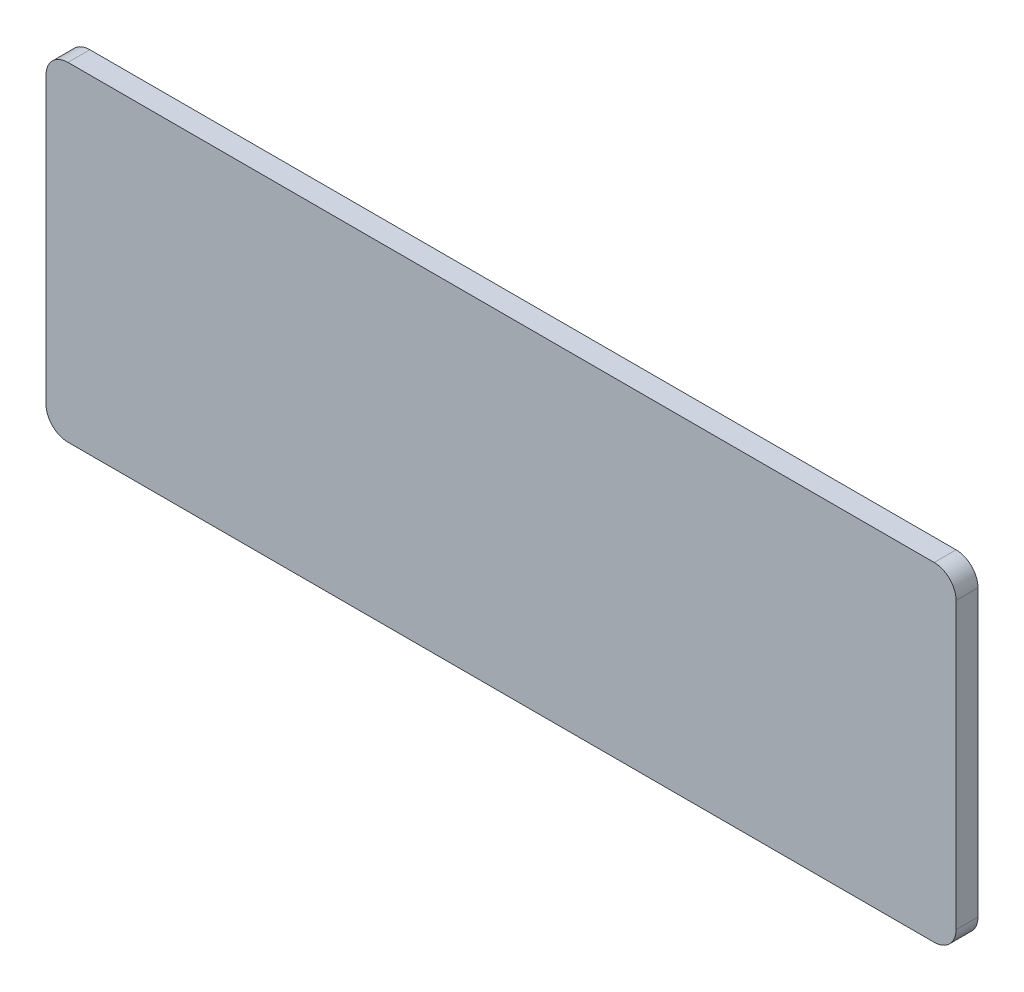
ISO-10303-21;
HEADER;
FILE_DESCRIPTION(('STEP AP214'),'2;1');
FILE_NAME('part.step','',(''),(''),'','','');
FILE_SCHEMA(('AUTOMOTIVE_DESIGN { 1 0 10303 214 1 1 1 1 }'));
ENDSEC;
DATA;
#1=APPLICATION_CONTEXT('core data for automotive mechanical design processes');
#2=APPLICATION_PROTOCOL_DEFINITION('international standard','automotive_design',2000,#1);
#3=PRODUCT_CONTEXT('',#1,'mechanical');
#4=PRODUCT('Part','Part','',(#3));
#5=PRODUCT_RELATED_PRODUCT_CATEGORY('part','',(#4));
#6=PRODUCT_DEFINITION_FORMATION('','',#4);
#7=PRODUCT_DEFINITION_CONTEXT('part definition',#1,'design');
#8=PRODUCT_DEFINITION('design','',#6,#7);
#9=PRODUCT_DEFINITION_SHAPE('','',#8);
#10=(LENGTH_UNIT() NAMED_UNIT(*) SI_UNIT(.MILLI.,.METRE.));
#11=(NAMED_UNIT(*) PLANE_ANGLE_UNIT() SI_UNIT($,.RADIAN.));
#12=(NAMED_UNIT(*) SI_UNIT($,.STERADIAN.) SOLID_ANGLE_UNIT());
#13=UNCERTAINTY_MEASURE_WITH_UNIT(LENGTH_MEASURE(1.E-05),#10,'distance_accuracy_value','');
#14=(GEOMETRIC_REPRESENTATION_CONTEXT(3) GLOBAL_UNCERTAINTY_ASSIGNED_CONTEXT((#13)) GLOBAL_UNIT_ASSIGNED_CONTEXT((#10,
#11,#12)) REPRESENTATION_CONTEXT('',''));
#15=CARTESIAN_POINT('',(0.,0.,0.));
#16=DIRECTION('',(0.,0.,1.));
#17=DIRECTION('',(1.,0.,0.));
#18=AXIS2_PLACEMENT_3D('',#15,#16,#17);
#19=CARTESIAN_POINT('',(205.,50.,10.));
#20=DIRECTION('',(0.,0.,-1.));
#21=DIRECTION('',(-1.,0.,0.));
#22=AXIS2_PLACEMENT_3D('',#19,#20,#21);
#23=CYLINDRICAL_SURFACE('',#22,10.);
#24=CARTESIAN_POINT('',(205.,50.,0.));
#25=DIRECTION('',(0.,0.,1.));
#26=DIRECTION('',(-1.,0.,0.));
#27=AXIS2_PLACEMENT_3D('',#24,#25,#26);
#28=CIRCLE('',#27,10.);
#29=CARTESIAN_POINT('',(215.,50.,0.));
#30=VERTEX_POINT('',#29);
#31=CARTESIAN_POINT('',(205.,60.,0.));
#32=VERTEX_POINT('',#31);
#33=EDGE_CURVE('E140',#30,#32,#28,.T.);
#34=ORIENTED_EDGE('',*,*,#33,.T.);
#35=DIRECTION('',(0.,0.,-1.));
#36=VECTOR('',#35,1.);
#37=CARTESIAN_POINT('',(205.,60.,10.));
#38=LINE('',#37,#36);
#39=CARTESIAN_POINT('',(205.,60.,10.));
#40=VERTEX_POINT('',#39);
#41=EDGE_CURVE('E11',#40,#32,#38,.T.);
#42=ORIENTED_EDGE('',*,*,#41,.F.);
#43=CARTESIAN_POINT('',(205.,50.,10.));
#44=DIRECTION('',(0.,0.,1.));
#45=DIRECTION('',(-1.,0.,0.));
#46=AXIS2_PLACEMENT_3D('',#43,#44,#45);
#47=CIRCLE('',#46,10.);
#48=CARTESIAN_POINT('',(215.,50.,10.));
#49=VERTEX_POINT('',#48);
#50=EDGE_CURVE('E162',#49,#40,#47,.T.);
#51=ORIENTED_EDGE('',*,*,#50,.F.);
#52=DIRECTION('',(0.,0.,-1.));
#53=VECTOR('',#52,1.);
#54=CARTESIAN_POINT('',(215.,50.,10.));
#55=LINE('',#54,#53);
#56=EDGE_CURVE('E136',#49,#30,#55,.T.);
#57=ORIENTED_EDGE('',*,*,#56,.T.);
#58=EDGE_LOOP('',(#34,#42,#51,#57));
#59=FACE_BOUND('',#58,.T.);
#60=ADVANCED_FACE('F39',(#59),#23,.T.);
#61=CARTESIAN_POINT('',(205.,60.,10.));
#62=DIRECTION('',(0.,-1.,0.));
#63=DIRECTION('',(1.,0.,0.));
#64=AXIS2_PLACEMENT_3D('',#61,#62,#63);
#65=PLANE('',#64);
#66=DIRECTION('',(-1.,0.,0.));
#67=VECTOR('',#66,1.);
#68=CARTESIAN_POINT('',(205.,60.,0.));
#69=LINE('',#68,#67);
#70=CARTESIAN_POINT('',(-190.,60.,0.));
#71=VERTEX_POINT('',#70);
#72=EDGE_CURVE('E144',#32,#71,#69,.T.);
#73=ORIENTED_EDGE('',*,*,#72,.T.);
#74=DIRECTION('',(0.,0.,-1.));
#75=VECTOR('',#74,1.);
#76=CARTESIAN_POINT('',(-190.,60.,10.));
#77=LINE('',#76,#75);
#78=CARTESIAN_POINT('',(-190.,60.,10.));
#79=VERTEX_POINT('',#78);
#80=EDGE_CURVE('E48',#79,#71,#77,.T.);
#81=ORIENTED_EDGE('',*,*,#80,.F.);
#82=DIRECTION('',(-1.,0.,0.));
#83=VECTOR('',#82,1.);
#84=CARTESIAN_POINT('',(205.,60.,10.));
#85=LINE('',#84,#83);
#86=EDGE_CURVE('E99',#40,#79,#85,.T.);
#87=ORIENTED_EDGE('',*,*,#86,.F.);
#88=ORIENTED_EDGE('',*,*,#41,.T.);
#89=EDGE_LOOP('',(#73,#81,#87,#88));
#90=FACE_BOUND('',#89,.T.);
#91=ADVANCED_FACE('F208',(#90),#65,.F.);
#92=CARTESIAN_POINT('',(-190.,50.,10.));
#93=DIRECTION('',(0.,0.,-1.));
#94=DIRECTION('',(-1.,0.,0.));
#95=AXIS2_PLACEMENT_3D('',#92,#93,#94);
#96=CYLINDRICAL_SURFACE('',#95,10.);
#97=CARTESIAN_POINT('',(-190.,50.,0.));
#98=DIRECTION('',(0.,0.,1.));
#99=DIRECTION('',(1.,0.,0.));
#100=AXIS2_PLACEMENT_3D('',#97,#98,#99);
#101=CIRCLE('',#100,10.);
#102=CARTESIAN_POINT('',(-200.,50.,0.));
#103=VERTEX_POINT('',#102);
#104=EDGE_CURVE('E147',#71,#103,#101,.T.);
#105=ORIENTED_EDGE('',*,*,#104,.T.);
#106=DIRECTION('',(0.,0.,-1.));
#107=VECTOR('',#106,1.);
#108=CARTESIAN_POINT('',(-200.,50.,10.));
#109=LINE('',#108,#107);
#110=CARTESIAN_POINT('',(-200.,50.,10.));
#111=VERTEX_POINT('',#110);
#112=EDGE_CURVE('E173',#111,#103,#109,.T.);
#113=ORIENTED_EDGE('',*,*,#112,.F.);
#114=CARTESIAN_POINT('',(-190.,50.,10.));
#115=DIRECTION('',(0.,0.,1.));
#116=DIRECTION('',(1.,0.,0.));
#117=AXIS2_PLACEMENT_3D('',#114,#115,#116);
#118=CIRCLE('',#117,10.);
#119=EDGE_CURVE('E183',#79,#111,#118,.T.);
#120=ORIENTED_EDGE('',*,*,#119,.F.);
#121=ORIENTED_EDGE('',*,*,#80,.T.);
#122=EDGE_LOOP('',(#105,#113,#120,#121));
#123=FACE_BOUND('',#122,.T.);
#124=ADVANCED_FACE('F181',(#123),#96,.T.);
#125=CARTESIAN_POINT('',(-200.,50.,10.));
#126=DIRECTION('',(1.,0.,0.));
#127=DIRECTION('',(0.,1.,0.));
#128=AXIS2_PLACEMENT_3D('',#125,#126,#127);
#129=PLANE('',#128);
#130=DIRECTION('',(0.,-1.,0.));
#131=VECTOR('',#130,1.);
#132=CARTESIAN_POINT('',(-200.,50.,0.));
#133=LINE('',#132,#131);
#134=CARTESIAN_POINT('',(-200.,-79.9999999999999,0.));
#135=VERTEX_POINT('',#134);
#136=EDGE_CURVE('E150',#103,#135,#133,.T.);
#137=ORIENTED_EDGE('',*,*,#136,.T.);
#138=DIRECTION('',(0.,0.,-1.));
#139=VECTOR('',#138,1.);
#140=CARTESIAN_POINT('',(-200.,-79.9999999999999,10.));
#141=LINE('',#140,#139);
#142=CARTESIAN_POINT('',(-200.,-79.9999999999999,10.));
#143=VERTEX_POINT('',#142);
#144=EDGE_CURVE('E169',#143,#135,#141,.T.);
#145=ORIENTED_EDGE('',*,*,#144,.F.);
#146=DIRECTION('',(0.,-1.,0.));
#147=VECTOR('',#146,1.);
#148=CARTESIAN_POINT('',(-200.,50.,10.));
#149=LINE('',#148,#147);
#150=EDGE_CURVE('E196',#111,#143,#149,.T.);
#151=ORIENTED_EDGE('',*,*,#150,.F.);
#152=ORIENTED_EDGE('',*,*,#112,.T.);
#153=EDGE_LOOP('',(#137,#145,#151,#152));
#154=FACE_BOUND('',#153,.T.);
#155=ADVANCED_FACE('F191',(#154),#129,.F.);
#156=CARTESIAN_POINT('',(-190.,-80.,10.));
#157=DIRECTION('',(0.,0.,-1.));
#158=DIRECTION('',(-1.,0.,0.));
#159=AXIS2_PLACEMENT_3D('',#156,#157,#158);
#160=CYLINDRICAL_SURFACE('',#159,9.99999999999998);
#161=CARTESIAN_POINT('',(-190.,-80.,0.));
#162=DIRECTION('',(0.,0.,1.));
#163=DIRECTION('',(-1.,0.,0.));
#164=AXIS2_PLACEMENT_3D('',#161,#162,#163);
#165=CIRCLE('',#164,9.99999999999998);
#166=CARTESIAN_POINT('',(-190.,-90.,0.));
#167=VERTEX_POINT('',#166);
#168=EDGE_CURVE('E153',#135,#167,#165,.T.);
#169=ORIENTED_EDGE('',*,*,#168,.T.);
#170=DIRECTION('',(0.,0.,-1.));
#171=VECTOR('',#170,1.);
#172=CARTESIAN_POINT('',(-190.,-90.,10.));
#173=LINE('',#172,#171);
#174=CARTESIAN_POINT('',(-190.,-90.,10.));
#175=VERTEX_POINT('',#174);
#176=EDGE_CURVE('E129',#175,#167,#173,.T.);
#177=ORIENTED_EDGE('',*,*,#176,.F.);
#178=CARTESIAN_POINT('',(-190.,-80.,10.));
#179=DIRECTION('',(0.,0.,1.));
#180=DIRECTION('',(-1.,0.,0.));
#181=AXIS2_PLACEMENT_3D('',#178,#179,#180);
#182=CIRCLE('',#181,9.99999999999998);
#183=EDGE_CURVE('E118',#143,#175,#182,.T.);
#184=ORIENTED_EDGE('',*,*,#183,.F.);
#185=ORIENTED_EDGE('',*,*,#144,.T.);
#186=EDGE_LOOP('',(#169,#177,#184,#185));
#187=FACE_BOUND('',#186,.T.);
#188=ADVANCED_FACE('F194',(#187),#160,.T.);
#189=CARTESIAN_POINT('',(205.,-90.,10.));
#190=DIRECTION('',(0.,1.,0.));
#191=DIRECTION('',(-1.,0.,0.));
#192=AXIS2_PLACEMENT_3D('',#189,#190,#191);
#193=PLANE('',#192);
#194=DIRECTION('',(1.,0.,0.));
#195=VECTOR('',#194,1.);
#196=CARTESIAN_POINT('',(205.,-90.,0.));
#197=LINE('',#196,#195);
#198=CARTESIAN_POINT('',(205.,-90.,0.));
#199=VERTEX_POINT('',#198);
#200=EDGE_CURVE('E127',#167,#199,#197,.T.);
#201=ORIENTED_EDGE('',*,*,#200,.T.);
#202=DIRECTION('',(0.,0.,-1.));
#203=VECTOR('',#202,1.);
#204=CARTESIAN_POINT('',(205.,-90.,10.));
#205=LINE('',#204,#203);
#206=CARTESIAN_POINT('',(205.,-90.,10.));
#207=VERTEX_POINT('',#206);
#208=EDGE_CURVE('E124',#207,#199,#205,.T.);
#209=ORIENTED_EDGE('',*,*,#208,.F.);
#210=DIRECTION('',(1.,0.,0.));
#211=VECTOR('',#210,1.);
#212=CARTESIAN_POINT('',(205.,-90.,10.));
#213=LINE('',#212,#211);
#214=EDGE_CURVE('E112',#175,#207,#213,.T.);
#215=ORIENTED_EDGE('',*,*,#214,.F.);
#216=ORIENTED_EDGE('',*,*,#176,.T.);
#217=EDGE_LOOP('',(#201,#209,#215,#216));
#218=FACE_BOUND('',#217,.T.);
#219=ADVANCED_FACE('F125',(#218),#193,.F.);
#220=CARTESIAN_POINT('',(205.,-80.,10.));
#221=DIRECTION('',(0.,0.,-1.));
#222=DIRECTION('',(-1.,0.,0.));
#223=AXIS2_PLACEMENT_3D('',#220,#221,#222);
#224=CYLINDRICAL_SURFACE('',#223,9.99999999999999);
#225=CARTESIAN_POINT('',(205.,-80.,0.));
#226=DIRECTION('',(0.,0.,1.));
#227=DIRECTION('',(-1.,0.,0.));
#228=AXIS2_PLACEMENT_3D('',#225,#226,#227);
#229=CIRCLE('',#228,9.99999999999999);
#230=CARTESIAN_POINT('',(215.,-79.9999999999999,0.));
#231=VERTEX_POINT('',#230);
#232=EDGE_CURVE('E85',#199,#231,#229,.T.);
#233=ORIENTED_EDGE('',*,*,#232,.T.);
#234=DIRECTION('',(0.,0.,-1.));
#235=VECTOR('',#234,1.);
#236=CARTESIAN_POINT('',(215.,-79.9999999999999,10.));
#237=LINE('',#236,#235);
#238=CARTESIAN_POINT('',(215.,-79.9999999999999,10.));
#239=VERTEX_POINT('',#238);
#240=EDGE_CURVE('E130',#239,#231,#237,.T.);
#241=ORIENTED_EDGE('',*,*,#240,.F.);
#242=CARTESIAN_POINT('',(205.,-80.,10.));
#243=DIRECTION('',(0.,0.,1.));
#244=DIRECTION('',(-1.,0.,0.));
#245=AXIS2_PLACEMENT_3D('',#242,#243,#244);
#246=CIRCLE('',#245,9.99999999999999);
#247=EDGE_CURVE('E116',#207,#239,#246,.T.);
#248=ORIENTED_EDGE('',*,*,#247,.F.);
#249=ORIENTED_EDGE('',*,*,#208,.T.);
#250=EDGE_LOOP('',(#233,#241,#248,#249));
#251=FACE_BOUND('',#250,.T.);
#252=ADVANCED_FACE('F132',(#251),#224,.T.);
#253=CARTESIAN_POINT('',(215.,50.,10.));
#254=DIRECTION('',(-1.,0.,0.));
#255=DIRECTION('',(0.,-1.,0.));
#256=AXIS2_PLACEMENT_3D('',#253,#254,#255);
#257=PLANE('',#256);
#258=DIRECTION('',(0.,1.,0.));
#259=VECTOR('',#258,1.);
#260=CARTESIAN_POINT('',(215.,50.,0.));
#261=LINE('',#260,#259);
#262=EDGE_CURVE('E91',#231,#30,#261,.T.);
#263=ORIENTED_EDGE('',*,*,#262,.T.);
#264=ORIENTED_EDGE('',*,*,#56,.F.);
#265=DIRECTION('',(0.,1.,0.));
#266=VECTOR('',#265,1.);
#267=CARTESIAN_POINT('',(215.,50.,10.));
#268=LINE('',#267,#266);
#269=EDGE_CURVE('E56',#239,#49,#268,.T.);
#270=ORIENTED_EDGE('',*,*,#269,.F.);
#271=ORIENTED_EDGE('',*,*,#240,.T.);
#272=EDGE_LOOP('',(#263,#264,#270,#271));
#273=FACE_BOUND('',#272,.T.);
#274=ADVANCED_FACE('F224',(#273),#257,.F.);
#275=CARTESIAN_POINT('',(205.,50.,10.));
#276=DIRECTION('',(0.,0.,-1.));
#277=DIRECTION('',(-1.,0.,0.));
#278=AXIS2_PLACEMENT_3D('',#275,#276,#277);
#279=PLANE('',#278);
#280=ORIENTED_EDGE('',*,*,#50,.T.);
#281=ORIENTED_EDGE('',*,*,#86,.T.);
#282=ORIENTED_EDGE('',*,*,#119,.T.);
#283=ORIENTED_EDGE('',*,*,#150,.T.);
#284=ORIENTED_EDGE('',*,*,#183,.T.);
#285=ORIENTED_EDGE('',*,*,#214,.T.);
#286=ORIENTED_EDGE('',*,*,#247,.T.);
#287=ORIENTED_EDGE('',*,*,#269,.T.);
#288=EDGE_LOOP('',(#280,#281,#282,#283,#284,#285,#286,#287));
#289=FACE_BOUND('',#288,.T.);
#290=ADVANCED_FACE('F114',(#289),#279,.F.);
#291=CARTESIAN_POINT('',(205.,50.,0.));
#292=DIRECTION('',(0.,0.,-1.));
#293=DIRECTION('',(-1.,0.,0.));
#294=AXIS2_PLACEMENT_3D('',#291,#292,#293);
#295=PLANE('',#294);
#296=ORIENTED_EDGE('',*,*,#33,.F.);
#297=ORIENTED_EDGE('',*,*,#262,.F.);
#298=ORIENTED_EDGE('',*,*,#232,.F.);
#299=ORIENTED_EDGE('',*,*,#200,.F.);
#300=ORIENTED_EDGE('',*,*,#168,.F.);
#301=ORIENTED_EDGE('',*,*,#136,.F.);
#302=ORIENTED_EDGE('',*,*,#104,.F.);
#303=ORIENTED_EDGE('',*,*,#72,.F.);
#304=EDGE_LOOP('',(#296,#297,#298,#299,#300,#301,#302,#303));
#305=FACE_BOUND('',#304,.T.);
#306=ADVANCED_FACE('F187',(#305),#295,.T.);
#307=CLOSED_SHELL('',(#60,#91,#124,#155,#188,#219,#252,#274,#290,#306));
#308=MANIFOLD_SOLID_BREP('B2',#307);
#309=ADVANCED_BREP_SHAPE_REPRESENTATION('',(#18,#308),#14);
#310=SHAPE_DEFINITION_REPRESENTATION(#9,#309);
ENDSEC;
END-ISO-10303-21;
